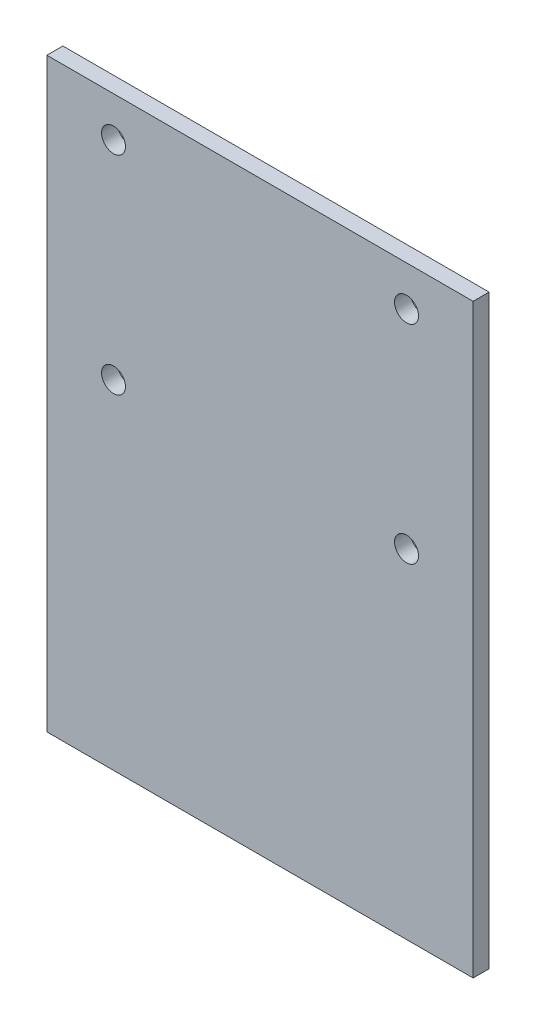
ISO-10303-21;
HEADER;
FILE_DESCRIPTION(('STEP AP214'),'2;1');
FILE_NAME('part.step','',(''),(''),'','','');
FILE_SCHEMA(('AUTOMOTIVE_DESIGN { 1 0 10303 214 1 1 1 1 }'));
ENDSEC;
DATA;
#1=APPLICATION_CONTEXT('core data for automotive mechanical design processes');
#2=APPLICATION_PROTOCOL_DEFINITION('international standard','automotive_design',2000,#1);
#3=PRODUCT_CONTEXT('',#1,'mechanical');
#4=PRODUCT('Part','Part','',(#3));
#5=PRODUCT_RELATED_PRODUCT_CATEGORY('part','',(#4));
#6=PRODUCT_DEFINITION_FORMATION('','',#4);
#7=PRODUCT_DEFINITION_CONTEXT('part definition',#1,'design');
#8=PRODUCT_DEFINITION('design','',#6,#7);
#9=PRODUCT_DEFINITION_SHAPE('','',#8);
#10=(LENGTH_UNIT() NAMED_UNIT(*) SI_UNIT(.MILLI.,.METRE.));
#11=(NAMED_UNIT(*) PLANE_ANGLE_UNIT() SI_UNIT($,.RADIAN.));
#12=(NAMED_UNIT(*) SI_UNIT($,.STERADIAN.) SOLID_ANGLE_UNIT());
#13=UNCERTAINTY_MEASURE_WITH_UNIT(LENGTH_MEASURE(1.E-05),#10,'distance_accuracy_value','');
#14=(GEOMETRIC_REPRESENTATION_CONTEXT(3) GLOBAL_UNCERTAINTY_ASSIGNED_CONTEXT((#13)) GLOBAL_UNIT_ASSIGNED_CONTEXT((#10,
#11,#12)) REPRESENTATION_CONTEXT('',''));
#15=CARTESIAN_POINT('',(0.,0.,0.));
#16=DIRECTION('',(0.,0.,1.));
#17=DIRECTION('',(1.,0.,0.));
#18=AXIS2_PLACEMENT_3D('',#15,#16,#17);
#19=CARTESIAN_POINT('',(-40.,-55.,3.));
#20=DIRECTION('',(1.,0.,0.));
#21=DIRECTION('',(0.,0.,-1.));
#22=AXIS2_PLACEMENT_3D('',#19,#20,#21);
#23=PLANE('',#22);
#24=DIRECTION('',(0.,-1.,0.));
#25=VECTOR('',#24,1.);
#26=CARTESIAN_POINT('',(-40.,-55.,0.));
#27=LINE('',#26,#25);
#28=CARTESIAN_POINT('',(-40.,55.,0.));
#29=VERTEX_POINT('',#28);
#30=CARTESIAN_POINT('',(-40.,-55.,0.));
#31=VERTEX_POINT('',#30);
#32=EDGE_CURVE('E102',#29,#31,#27,.T.);
#33=ORIENTED_EDGE('',*,*,#32,.T.);
#34=DIRECTION('',(0.,0.,-1.));
#35=VECTOR('',#34,1.);
#36=CARTESIAN_POINT('',(-40.,-55.,3.));
#37=LINE('',#36,#35);
#38=CARTESIAN_POINT('',(-40.,-55.,3.));
#39=VERTEX_POINT('',#38);
#40=EDGE_CURVE('E11',#39,#31,#37,.T.);
#41=ORIENTED_EDGE('',*,*,#40,.F.);
#42=DIRECTION('',(0.,-1.,0.));
#43=VECTOR('',#42,1.);
#44=CARTESIAN_POINT('',(-40.,-55.,3.));
#45=LINE('',#44,#43);
#46=CARTESIAN_POINT('',(-40.,55.,3.));
#47=VERTEX_POINT('',#46);
#48=EDGE_CURVE('E90',#47,#39,#45,.T.);
#49=ORIENTED_EDGE('',*,*,#48,.F.);
#50=DIRECTION('',(0.,0.,-1.));
#51=VECTOR('',#50,1.);
#52=CARTESIAN_POINT('',(-40.,55.,3.));
#53=LINE('',#52,#51);
#54=EDGE_CURVE('E98',#47,#29,#53,.T.);
#55=ORIENTED_EDGE('',*,*,#54,.T.);
#56=EDGE_LOOP('',(#33,#41,#49,#55));
#57=FACE_BOUND('',#56,.T.);
#58=ADVANCED_FACE('F39',(#57),#23,.F.);
#59=CARTESIAN_POINT('',(40.,-55.,3.));
#60=DIRECTION('',(0.,1.,0.));
#61=DIRECTION('',(-1.,0.,0.));
#62=AXIS2_PLACEMENT_3D('',#59,#60,#61);
#63=PLANE('',#62);
#64=DIRECTION('',(1.,0.,0.));
#65=VECTOR('',#64,1.);
#66=CARTESIAN_POINT('',(40.,-55.,0.));
#67=LINE('',#66,#65);
#68=CARTESIAN_POINT('',(40.,-55.,0.));
#69=VERTEX_POINT('',#68);
#70=EDGE_CURVE('E94',#31,#69,#67,.T.);
#71=ORIENTED_EDGE('',*,*,#70,.T.);
#72=DIRECTION('',(0.,0.,-1.));
#73=VECTOR('',#72,1.);
#74=CARTESIAN_POINT('',(40.,-55.,3.));
#75=LINE('',#74,#73);
#76=CARTESIAN_POINT('',(40.,-55.,3.));
#77=VERTEX_POINT('',#76);
#78=EDGE_CURVE('E47',#77,#69,#75,.T.);
#79=ORIENTED_EDGE('',*,*,#78,.F.);
#80=DIRECTION('',(1.,0.,0.));
#81=VECTOR('',#80,1.);
#82=CARTESIAN_POINT('',(40.,-55.,3.));
#83=LINE('',#82,#81);
#84=EDGE_CURVE('E85',#39,#77,#83,.T.);
#85=ORIENTED_EDGE('',*,*,#84,.F.);
#86=ORIENTED_EDGE('',*,*,#40,.T.);
#87=EDGE_LOOP('',(#71,#79,#85,#86));
#88=FACE_BOUND('',#87,.T.);
#89=ADVANCED_FACE('F93',(#88),#63,.F.);
#90=CARTESIAN_POINT('',(40.,-55.,3.));
#91=DIRECTION('',(-1.,0.,0.));
#92=DIRECTION('',(0.,0.,1.));
#93=AXIS2_PLACEMENT_3D('',#90,#91,#92);
#94=PLANE('',#93);
#95=DIRECTION('',(0.,1.,0.));
#96=VECTOR('',#95,1.);
#97=CARTESIAN_POINT('',(40.,-55.,0.));
#98=LINE('',#97,#96);
#99=CARTESIAN_POINT('',(40.,55.,0.));
#100=VERTEX_POINT('',#99);
#101=EDGE_CURVE('E72',#69,#100,#98,.T.);
#102=ORIENTED_EDGE('',*,*,#101,.T.);
#103=DIRECTION('',(0.,0.,-1.));
#104=VECTOR('',#103,1.);
#105=CARTESIAN_POINT('',(40.,55.,3.));
#106=LINE('',#105,#104);
#107=CARTESIAN_POINT('',(40.,55.,3.));
#108=VERTEX_POINT('',#107);
#109=EDGE_CURVE('E95',#108,#100,#106,.T.);
#110=ORIENTED_EDGE('',*,*,#109,.F.);
#111=DIRECTION('',(0.,1.,0.));
#112=VECTOR('',#111,1.);
#113=CARTESIAN_POINT('',(40.,-55.,3.));
#114=LINE('',#113,#112);
#115=EDGE_CURVE('E88',#77,#108,#114,.T.);
#116=ORIENTED_EDGE('',*,*,#115,.F.);
#117=ORIENTED_EDGE('',*,*,#78,.T.);
#118=EDGE_LOOP('',(#102,#110,#116,#117));
#119=FACE_BOUND('',#118,.T.);
#120=ADVANCED_FACE('F96',(#119),#94,.F.);
#121=CARTESIAN_POINT('',(40.,55.,3.));
#122=DIRECTION('',(0.,-1.,0.));
#123=DIRECTION('',(1.,0.,0.));
#124=AXIS2_PLACEMENT_3D('',#121,#122,#123);
#125=PLANE('',#124);
#126=DIRECTION('',(-1.,0.,0.));
#127=VECTOR('',#126,1.);
#128=CARTESIAN_POINT('',(40.,55.,0.));
#129=LINE('',#128,#127);
#130=EDGE_CURVE('E78',#100,#29,#129,.T.);
#131=ORIENTED_EDGE('',*,*,#130,.T.);
#132=ORIENTED_EDGE('',*,*,#54,.F.);
#133=DIRECTION('',(-1.,0.,0.));
#134=VECTOR('',#133,1.);
#135=CARTESIAN_POINT('',(40.,55.,3.));
#136=LINE('',#135,#134);
#137=EDGE_CURVE('E55',#108,#47,#136,.T.);
#138=ORIENTED_EDGE('',*,*,#137,.F.);
#139=ORIENTED_EDGE('',*,*,#109,.T.);
#140=EDGE_LOOP('',(#131,#132,#138,#139));
#141=FACE_BOUND('',#140,.T.);
#142=ADVANCED_FACE('F110',(#141),#125,.F.);
#143=CARTESIAN_POINT('',(0.,0.,3.));
#144=DIRECTION('',(0.,0.,1.));
#145=DIRECTION('',(1.,0.,0.));
#146=AXIS2_PLACEMENT_3D('',#143,#144,#145);
#147=PLANE('',#146);
#148=CARTESIAN_POINT('',(27.5000022904123,47.500001598169,3.));
#149=DIRECTION('',(0.,0.,1.));
#150=DIRECTION('',(1.,0.,0.));
#151=AXIS2_PLACEMENT_3D('',#148,#149,#150);
#152=CIRCLE('',#151,2.24999999999999);
#153=CARTESIAN_POINT('',(29.7500022904123,47.500001598169,3.));
#154=VERTEX_POINT('',#153);
#155=EDGE_CURVE('E136',#154,#154,#152,.T.);
#156=ORIENTED_EDGE('',*,*,#155,.F.);
#157=EDGE_LOOP('',(#156));
#158=FACE_BOUND('',#157,.T.);
#159=CARTESIAN_POINT('',(27.5000022904123,8.50000159816899,3.));
#160=DIRECTION('',(0.,0.,1.));
#161=DIRECTION('',(1.,0.,0.));
#162=AXIS2_PLACEMENT_3D('',#159,#160,#161);
#163=CIRCLE('',#162,2.24999999999999);
#164=CARTESIAN_POINT('',(29.7500022904123,8.50000159816899,3.));
#165=VERTEX_POINT('',#164);
#166=EDGE_CURVE('E130',#165,#165,#163,.T.);
#167=ORIENTED_EDGE('',*,*,#166,.F.);
#168=EDGE_LOOP('',(#167));
#169=FACE_BOUND('',#168,.T.);
#170=CARTESIAN_POINT('',(-27.4999977095877,8.50000159816893,3.));
#171=DIRECTION('',(0.,0.,1.));
#172=DIRECTION('',(1.,0.,0.));
#173=AXIS2_PLACEMENT_3D('',#170,#171,#172);
#174=CIRCLE('',#173,2.24999999999999);
#175=CARTESIAN_POINT('',(-25.2499977095877,8.50000159816893,3.));
#176=VERTEX_POINT('',#175);
#177=EDGE_CURVE('E124',#176,#176,#174,.T.);
#178=ORIENTED_EDGE('',*,*,#177,.F.);
#179=EDGE_LOOP('',(#178));
#180=FACE_BOUND('',#179,.T.);
#181=CARTESIAN_POINT('',(-27.4999977095877,47.5000015981689,3.));
#182=DIRECTION('',(0.,0.,1.));
#183=DIRECTION('',(1.,0.,0.));
#184=AXIS2_PLACEMENT_3D('',#181,#182,#183);
#185=CIRCLE('',#184,2.24999999999999);
#186=CARTESIAN_POINT('',(-25.2499977095877,47.5000015981689,3.));
#187=VERTEX_POINT('',#186);
#188=EDGE_CURVE('E118',#187,#187,#185,.T.);
#189=ORIENTED_EDGE('',*,*,#188,.F.);
#190=EDGE_LOOP('',(#189));
#191=FACE_BOUND('',#190,.T.);
#192=ORIENTED_EDGE('',*,*,#48,.T.);
#193=ORIENTED_EDGE('',*,*,#84,.T.);
#194=ORIENTED_EDGE('',*,*,#115,.T.);
#195=ORIENTED_EDGE('',*,*,#137,.T.);
#196=EDGE_LOOP('',(#192,#193,#194,#195));
#197=FACE_BOUND('',#196,.T.);
#198=ADVANCED_FACE('F86',(#158,#169,#180,#191,#197),#147,.T.);
#199=CARTESIAN_POINT('',(0.,0.,0.));
#200=DIRECTION('',(0.,0.,1.));
#201=DIRECTION('',(1.,0.,0.));
#202=AXIS2_PLACEMENT_3D('',#199,#200,#201);
#203=PLANE('',#202);
#204=CARTESIAN_POINT('',(27.5000022904123,47.500001598169,0.));
#205=DIRECTION('',(0.,0.,1.));
#206=DIRECTION('',(1.,0.,0.));
#207=AXIS2_PLACEMENT_3D('',#204,#205,#206);
#208=CIRCLE('',#207,2.25);
#209=CARTESIAN_POINT('',(29.7500022904123,47.500001598169,0.));
#210=VERTEX_POINT('',#209);
#211=EDGE_CURVE('E133',#210,#210,#208,.T.);
#212=ORIENTED_EDGE('',*,*,#211,.T.);
#213=EDGE_LOOP('',(#212));
#214=FACE_BOUND('',#213,.T.);
#215=CARTESIAN_POINT('',(27.5000022904123,8.50000159816899,0.));
#216=DIRECTION('',(0.,0.,1.));
#217=DIRECTION('',(1.,0.,0.));
#218=AXIS2_PLACEMENT_3D('',#215,#216,#217);
#219=CIRCLE('',#218,2.25);
#220=CARTESIAN_POINT('',(29.7500022904123,8.50000159816899,0.));
#221=VERTEX_POINT('',#220);
#222=EDGE_CURVE('E127',#221,#221,#219,.T.);
#223=ORIENTED_EDGE('',*,*,#222,.T.);
#224=EDGE_LOOP('',(#223));
#225=FACE_BOUND('',#224,.T.);
#226=CARTESIAN_POINT('',(-27.4999977095877,8.50000159816893,0.));
#227=DIRECTION('',(0.,0.,1.));
#228=DIRECTION('',(1.,0.,0.));
#229=AXIS2_PLACEMENT_3D('',#226,#227,#228);
#230=CIRCLE('',#229,2.25);
#231=CARTESIAN_POINT('',(-25.2499977095877,8.50000159816893,0.));
#232=VERTEX_POINT('',#231);
#233=EDGE_CURVE('E121',#232,#232,#230,.T.);
#234=ORIENTED_EDGE('',*,*,#233,.T.);
#235=EDGE_LOOP('',(#234));
#236=FACE_BOUND('',#235,.T.);
#237=CARTESIAN_POINT('',(-27.4999977095877,47.5000015981689,0.));
#238=DIRECTION('',(0.,0.,1.));
#239=DIRECTION('',(1.,0.,0.));
#240=AXIS2_PLACEMENT_3D('',#237,#238,#239);
#241=CIRCLE('',#240,2.25);
#242=CARTESIAN_POINT('',(-25.2499977095877,47.5000015981689,0.));
#243=VERTEX_POINT('',#242);
#244=EDGE_CURVE('E105',#243,#243,#241,.T.);
#245=ORIENTED_EDGE('',*,*,#244,.T.);
#246=EDGE_LOOP('',(#245));
#247=FACE_BOUND('',#246,.T.);
#248=ORIENTED_EDGE('',*,*,#32,.F.);
#249=ORIENTED_EDGE('',*,*,#130,.F.);
#250=ORIENTED_EDGE('',*,*,#101,.F.);
#251=ORIENTED_EDGE('',*,*,#70,.F.);
#252=EDGE_LOOP('',(#248,#249,#250,#251));
#253=FACE_BOUND('',#252,.T.);
#254=ADVANCED_FACE('F113',(#214,#225,#236,#247,#253),#203,.F.);
#255=CARTESIAN_POINT('',(-27.4999977095877,47.5000015981689,3.));
#256=DIRECTION('',(0.,0.,1.));
#257=DIRECTION('',(1.,0.,0.));
#258=AXIS2_PLACEMENT_3D('',#255,#256,#257);
#259=CYLINDRICAL_SURFACE('',#258,2.24999999999999);
#260=ORIENTED_EDGE('',*,*,#244,.F.);
#261=EDGE_LOOP('',(#260));
#262=FACE_BOUND('',#261,.T.);
#263=ORIENTED_EDGE('',*,*,#188,.T.);
#264=EDGE_LOOP('',(#263));
#265=FACE_BOUND('',#264,.T.);
#266=ADVANCED_FACE('F151',(#262,#265),#259,.F.);
#267=CARTESIAN_POINT('',(-27.4999977095877,8.50000159816893,3.));
#268=DIRECTION('',(0.,0.,1.));
#269=DIRECTION('',(1.,0.,0.));
#270=AXIS2_PLACEMENT_3D('',#267,#268,#269);
#271=CYLINDRICAL_SURFACE('',#270,2.24999999999999);
#272=ORIENTED_EDGE('',*,*,#233,.F.);
#273=EDGE_LOOP('',(#272));
#274=FACE_BOUND('',#273,.T.);
#275=ORIENTED_EDGE('',*,*,#177,.T.);
#276=EDGE_LOOP('',(#275));
#277=FACE_BOUND('',#276,.T.);
#278=ADVANCED_FACE('F153',(#274,#277),#271,.F.);
#279=CARTESIAN_POINT('',(27.5000022904123,8.50000159816899,3.));
#280=DIRECTION('',(0.,0.,1.));
#281=DIRECTION('',(1.,0.,0.));
#282=AXIS2_PLACEMENT_3D('',#279,#280,#281);
#283=CYLINDRICAL_SURFACE('',#282,2.24999999999999);
#284=ORIENTED_EDGE('',*,*,#222,.F.);
#285=EDGE_LOOP('',(#284));
#286=FACE_BOUND('',#285,.T.);
#287=ORIENTED_EDGE('',*,*,#166,.T.);
#288=EDGE_LOOP('',(#287));
#289=FACE_BOUND('',#288,.T.);
#290=ADVANCED_FACE('F160',(#286,#289),#283,.F.);
#291=CARTESIAN_POINT('',(27.5000022904123,47.500001598169,3.));
#292=DIRECTION('',(0.,0.,1.));
#293=DIRECTION('',(1.,0.,0.));
#294=AXIS2_PLACEMENT_3D('',#291,#292,#293);
#295=CYLINDRICAL_SURFACE('',#294,2.24999999999999);
#296=ORIENTED_EDGE('',*,*,#211,.F.);
#297=EDGE_LOOP('',(#296));
#298=FACE_BOUND('',#297,.T.);
#299=ORIENTED_EDGE('',*,*,#155,.T.);
#300=EDGE_LOOP('',(#299));
#301=FACE_BOUND('',#300,.T.);
#302=ADVANCED_FACE('F140',(#298,#301),#295,.F.);
#303=CLOSED_SHELL('',(#58,#89,#120,#142,#198,#254,#266,#278,#290,#302));
#304=MANIFOLD_SOLID_BREP('B2',#303);
#305=ADVANCED_BREP_SHAPE_REPRESENTATION('',(#18,#304),#14);
#306=SHAPE_DEFINITION_REPRESENTATION(#9,#305);
ENDSEC;
END-ISO-10303-21;
